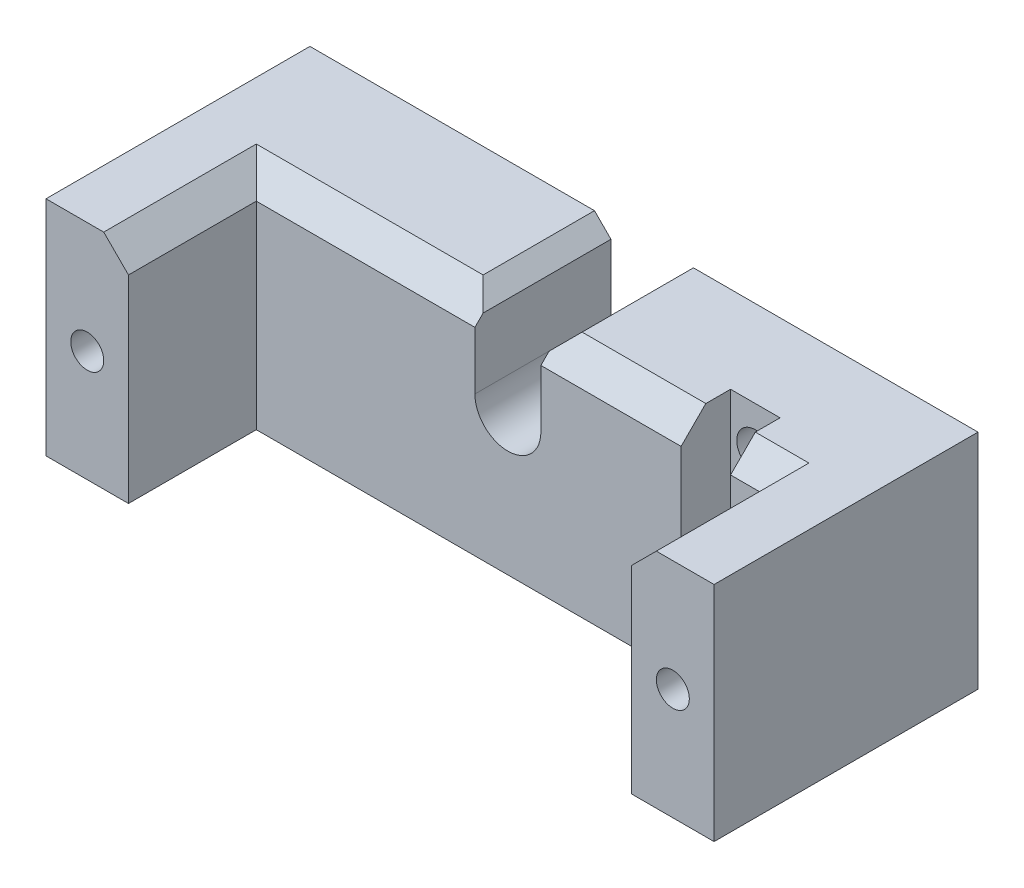
ISO-10303-21;
HEADER;
FILE_DESCRIPTION(('STEP AP214'),'2;1');
FILE_NAME('part.step','',(''),(''),'','','');
FILE_SCHEMA(('AUTOMOTIVE_DESIGN { 1 0 10303 214 1 1 1 1 }'));
ENDSEC;
DATA;
#1=APPLICATION_CONTEXT('core data for automotive mechanical design processes');
#2=APPLICATION_PROTOCOL_DEFINITION('international standard','automotive_design',2000,#1);
#3=PRODUCT_CONTEXT('',#1,'mechanical');
#4=PRODUCT('Part','Part','',(#3));
#5=PRODUCT_RELATED_PRODUCT_CATEGORY('part','',(#4));
#6=PRODUCT_DEFINITION_FORMATION('','',#4);
#7=PRODUCT_DEFINITION_CONTEXT('part definition',#1,'design');
#8=PRODUCT_DEFINITION('design','',#6,#7);
#9=PRODUCT_DEFINITION_SHAPE('','',#8);
#10=(LENGTH_UNIT() NAMED_UNIT(*) SI_UNIT(.MILLI.,.METRE.));
#11=(NAMED_UNIT(*) PLANE_ANGLE_UNIT() SI_UNIT($,.RADIAN.));
#12=(NAMED_UNIT(*) SI_UNIT($,.STERADIAN.) SOLID_ANGLE_UNIT());
#13=UNCERTAINTY_MEASURE_WITH_UNIT(LENGTH_MEASURE(1.E-05),#10,'distance_accuracy_value','');
#14=(GEOMETRIC_REPRESENTATION_CONTEXT(3) GLOBAL_UNCERTAINTY_ASSIGNED_CONTEXT((#13)) GLOBAL_UNIT_ASSIGNED_CONTEXT((#10,
#11,#12)) REPRESENTATION_CONTEXT('',''));
#15=CARTESIAN_POINT('',(0.,0.,0.));
#16=DIRECTION('',(0.,0.,1.));
#17=DIRECTION('',(1.,0.,0.));
#18=AXIS2_PLACEMENT_3D('',#15,#16,#17);
#19=CARTESIAN_POINT('',(0.,0.,16.5));
#20=DIRECTION('',(0.,0.,1.));
#21=DIRECTION('',(1.,0.,0.));
#22=AXIS2_PLACEMENT_3D('',#19,#20,#21);
#23=PLANE('',#22);
#24=DIRECTION('',(0.,1.,0.));
#25=VECTOR('',#24,1.);
#26=CARTESIAN_POINT('',(30.5,13.5,16.5));
#27=LINE('',#26,#25);
#28=CARTESIAN_POINT('',(30.5,-13.5,16.5));
#29=VERTEX_POINT('',#28);
#30=CARTESIAN_POINT('',(30.5,10.5,16.5));
#31=VERTEX_POINT('',#30);
#32=EDGE_CURVE('E346',#29,#31,#27,.T.);
#33=ORIENTED_EDGE('',*,*,#32,.T.);
#34=DIRECTION('',(-1.,0.,0.));
#35=VECTOR('',#34,1.);
#36=CARTESIAN_POINT('',(27.,10.5,16.5));
#37=LINE('',#36,#35);
#38=CARTESIAN_POINT('',(27.,10.5,16.5));
#39=VERTEX_POINT('',#38);
#40=EDGE_CURVE('E419',#31,#39,#37,.T.);
#41=ORIENTED_EDGE('',*,*,#40,.T.);
#42=DIRECTION('',(0.,1.,0.));
#43=VECTOR('',#42,1.);
#44=CARTESIAN_POINT('',(27.,0.,16.5));
#45=LINE('',#44,#43);
#46=CARTESIAN_POINT('',(27.,-13.5,16.5));
#47=VERTEX_POINT('',#46);
#48=EDGE_CURVE('E414',#47,#39,#45,.T.);
#49=ORIENTED_EDGE('',*,*,#48,.F.);
#50=DIRECTION('',(1.,0.,0.));
#51=VECTOR('',#50,1.);
#52=CARTESIAN_POINT('',(-30.5,-13.5,16.5));
#53=LINE('',#52,#51);
#54=EDGE_CURVE('E354',#47,#29,#53,.T.);
#55=ORIENTED_EDGE('',*,*,#54,.T.);
#56=EDGE_LOOP('',(#33,#41,#49,#55));
#57=FACE_BOUND('',#56,.T.);
#58=ADVANCED_FACE('F36',(#57),#23,.T.);
#59=CARTESIAN_POINT('',(-35.5,0.,-8.));
#60=DIRECTION('',(0.,0.,1.));
#61=DIRECTION('',(1.,0.,0.));
#62=AXIS2_PLACEMENT_3D('',#59,#60,#61);
#63=CYLINDRICAL_SURFACE('',#62,2.);
#64=CARTESIAN_POINT('',(-35.5,0.,32.));
#65=DIRECTION('',(0.,0.,1.));
#66=DIRECTION('',(1.,0.,0.));
#67=AXIS2_PLACEMENT_3D('',#64,#65,#66);
#68=CIRCLE('',#67,2.);
#69=CARTESIAN_POINT('',(-33.5,0.,32.));
#70=VERTEX_POINT('',#69);
#71=EDGE_CURVE('E249',#70,#70,#68,.T.);
#72=ORIENTED_EDGE('',*,*,#71,.T.);
#73=EDGE_LOOP('',(#72));
#74=FACE_BOUND('',#73,.T.);
#75=CARTESIAN_POINT('',(-35.5,0.,4.));
#76=DIRECTION('',(0.,0.,-1.));
#77=DIRECTION('',(-1.,0.,0.));
#78=AXIS2_PLACEMENT_3D('',#75,#76,#77);
#79=CIRCLE('',#78,2.);
#80=CARTESIAN_POINT('',(-37.5,0.,4.));
#81=VERTEX_POINT('',#80);
#82=EDGE_CURVE('E258',#81,#81,#79,.F.);
#83=ORIENTED_EDGE('',*,*,#82,.F.);
#84=EDGE_LOOP('',(#83));
#85=FACE_BOUND('',#84,.T.);
#86=ADVANCED_FACE('F605',(#74,#85),#63,.F.);
#87=CARTESIAN_POINT('',(35.5,0.,-8.));
#88=DIRECTION('',(0.,0.,1.));
#89=DIRECTION('',(1.,0.,0.));
#90=AXIS2_PLACEMENT_3D('',#87,#88,#89);
#91=CYLINDRICAL_SURFACE('',#90,2.);
#92=CARTESIAN_POINT('',(35.5,0.,32.));
#93=DIRECTION('',(0.,0.,1.));
#94=DIRECTION('',(1.,0.,0.));
#95=AXIS2_PLACEMENT_3D('',#92,#93,#94);
#96=CIRCLE('',#95,2.);
#97=CARTESIAN_POINT('',(37.5,0.,32.));
#98=VERTEX_POINT('',#97);
#99=EDGE_CURVE('E254',#98,#98,#96,.T.);
#100=ORIENTED_EDGE('',*,*,#99,.T.);
#101=EDGE_LOOP('',(#100));
#102=FACE_BOUND('',#101,.T.);
#103=CARTESIAN_POINT('',(35.5,0.,4.));
#104=DIRECTION('',(0.,0.,-1.));
#105=DIRECTION('',(-1.,0.,0.));
#106=AXIS2_PLACEMENT_3D('',#103,#104,#105);
#107=CIRCLE('',#106,2.);
#108=CARTESIAN_POINT('',(33.5,0.,4.));
#109=VERTEX_POINT('',#108);
#110=EDGE_CURVE('E237',#109,#109,#107,.F.);
#111=ORIENTED_EDGE('',*,*,#110,.F.);
#112=EDGE_LOOP('',(#111));
#113=FACE_BOUND('',#112,.T.);
#114=ADVANCED_FACE('F610',(#102,#113),#91,.F.);
#115=CARTESIAN_POINT('',(-30.5,13.5,16.5));
#116=DIRECTION('',(0.,-1.,0.));
#117=DIRECTION('',(0.,0.,-1.));
#118=AXIS2_PLACEMENT_3D('',#115,#116,#117);
#119=PLANE('',#118);
#120=DIRECTION('',(0.,0.,-1.));
#121=VECTOR('',#120,1.);
#122=CARTESIAN_POINT('',(-33.5,13.5,16.5));
#123=LINE('',#122,#121);
#124=CARTESIAN_POINT('',(-33.5,13.5,32.));
#125=VERTEX_POINT('',#124);
#126=CARTESIAN_POINT('',(-33.5,13.5,13.5));
#127=VERTEX_POINT('',#126);
#128=EDGE_CURVE('E60',#125,#127,#123,.T.);
#129=ORIENTED_EDGE('',*,*,#128,.T.);
#130=DIRECTION('',(1.,0.,0.));
#131=VECTOR('',#130,1.);
#132=CARTESIAN_POINT('',(-6.,13.5,13.5));
#133=LINE('',#132,#131);
#134=CARTESIAN_POINT('',(-5.99999999999999,13.5,13.5));
#135=VERTEX_POINT('',#134);
#136=EDGE_CURVE('E458',#127,#135,#133,.T.);
#137=ORIENTED_EDGE('',*,*,#136,.T.);
#138=DIRECTION('',(0.,0.,-1.));
#139=VECTOR('',#138,1.);
#140=CARTESIAN_POINT('',(-5.99999999999999,13.5,16.5));
#141=LINE('',#140,#139);
#142=CARTESIAN_POINT('',(-6.,13.5,0.));
#143=VERTEX_POINT('',#142);
#144=EDGE_CURVE('E368',#135,#143,#141,.T.);
#145=ORIENTED_EDGE('',*,*,#144,.T.);
#146=DIRECTION('',(-1.,0.,0.));
#147=VECTOR('',#146,1.);
#148=CARTESIAN_POINT('',(-30.5,13.5,0.));
#149=LINE('',#148,#147);
#150=CARTESIAN_POINT('',(-40.5,13.5,0.));
#151=VERTEX_POINT('',#150);
#152=EDGE_CURVE('E343',#143,#151,#149,.T.);
#153=ORIENTED_EDGE('',*,*,#152,.T.);
#154=DIRECTION('',(0.,0.,-1.));
#155=VECTOR('',#154,1.);
#156=CARTESIAN_POINT('',(-40.5,13.5,32.));
#157=LINE('',#156,#155);
#158=CARTESIAN_POINT('',(-40.5,13.5,32.));
#159=VERTEX_POINT('',#158);
#160=EDGE_CURVE('E277',#159,#151,#157,.T.);
#161=ORIENTED_EDGE('',*,*,#160,.F.);
#162=DIRECTION('',(1.,0.,0.));
#163=VECTOR('',#162,1.);
#164=CARTESIAN_POINT('',(-30.5,13.5,32.));
#165=LINE('',#164,#163);
#166=EDGE_CURVE('E270',#159,#125,#165,.T.);
#167=ORIENTED_EDGE('',*,*,#166,.T.);
#168=EDGE_LOOP('',(#129,#137,#145,#153,#161,#167));
#169=FACE_BOUND('',#168,.T.);
#170=ADVANCED_FACE('F555',(#169),#119,.F.);
#171=DIRECTION('',(0.,0.,-1.));
#172=VECTOR('',#171,1.);
#173=CARTESIAN_POINT('',(27.,13.5,16.5));
#174=LINE('',#173,#172);
#175=CARTESIAN_POINT('',(27.,13.5,13.5));
#176=VERTEX_POINT('',#175);
#177=CARTESIAN_POINT('',(27.,13.5,10.5));
#178=VERTEX_POINT('',#177);
#179=EDGE_CURVE('E188',#176,#178,#174,.T.);
#180=ORIENTED_EDGE('',*,*,#179,.F.);
#181=DIRECTION('',(1.,0.,0.));
#182=VECTOR('',#181,1.);
#183=CARTESIAN_POINT('',(33.5,13.5,13.5));
#184=LINE('',#183,#182);
#185=CARTESIAN_POINT('',(33.5,13.5,13.5));
#186=VERTEX_POINT('',#185);
#187=EDGE_CURVE('E438',#176,#186,#184,.T.);
#188=ORIENTED_EDGE('',*,*,#187,.T.);
#189=DIRECTION('',(0.,0.,1.));
#190=VECTOR('',#189,1.);
#191=CARTESIAN_POINT('',(33.5,13.5,32.));
#192=LINE('',#191,#190);
#193=CARTESIAN_POINT('',(33.5,13.5,32.));
#194=VERTEX_POINT('',#193);
#195=EDGE_CURVE('E405',#186,#194,#192,.T.);
#196=ORIENTED_EDGE('',*,*,#195,.T.);
#197=DIRECTION('',(1.,0.,0.));
#198=VECTOR('',#197,1.);
#199=CARTESIAN_POINT('',(30.5,13.5,32.));
#200=LINE('',#199,#198);
#201=CARTESIAN_POINT('',(40.5,13.5,32.));
#202=VERTEX_POINT('',#201);
#203=EDGE_CURVE('E293',#194,#202,#200,.T.);
#204=ORIENTED_EDGE('',*,*,#203,.T.);
#205=DIRECTION('',(0.,0.,-1.));
#206=VECTOR('',#205,1.);
#207=CARTESIAN_POINT('',(40.5,13.5,32.));
#208=LINE('',#207,#206);
#209=CARTESIAN_POINT('',(40.5,13.5,0.));
#210=VERTEX_POINT('',#209);
#211=EDGE_CURVE('E304',#202,#210,#208,.T.);
#212=ORIENTED_EDGE('',*,*,#211,.T.);
#213=CARTESIAN_POINT('',(5.99999999999997,13.5,0.));
#214=VERTEX_POINT('',#213);
#215=EDGE_CURVE('E360',#210,#214,#149,.T.);
#216=ORIENTED_EDGE('',*,*,#215,.T.);
#217=DIRECTION('',(0.,0.,1.));
#218=VECTOR('',#217,1.);
#219=CARTESIAN_POINT('',(5.99999999999998,13.5,16.5));
#220=LINE('',#219,#218);
#221=CARTESIAN_POINT('',(5.99999999999998,13.5,13.5));
#222=VERTEX_POINT('',#221);
#223=EDGE_CURVE('E386',#214,#222,#220,.T.);
#224=ORIENTED_EDGE('',*,*,#223,.T.);
#225=DIRECTION('',(1.,0.,0.));
#226=VECTOR('',#225,1.);
#227=CARTESIAN_POINT('',(21.,13.5,13.5));
#228=LINE('',#227,#226);
#229=CARTESIAN_POINT('',(21.,13.5,13.5));
#230=VERTEX_POINT('',#229);
#231=EDGE_CURVE('E435',#222,#230,#228,.T.);
#232=ORIENTED_EDGE('',*,*,#231,.T.);
#233=DIRECTION('',(0.,0.,1.));
#234=VECTOR('',#233,1.);
#235=CARTESIAN_POINT('',(21.,13.5,16.5));
#236=LINE('',#235,#234);
#237=CARTESIAN_POINT('',(21.,13.5,10.5));
#238=VERTEX_POINT('',#237);
#239=EDGE_CURVE('E212',#238,#230,#236,.T.);
#240=ORIENTED_EDGE('',*,*,#239,.F.);
#241=DIRECTION('',(-1.,0.,0.));
#242=VECTOR('',#241,1.);
#243=CARTESIAN_POINT('',(27.,13.5,10.5));
#244=LINE('',#243,#242);
#245=EDGE_CURVE('E200',#178,#238,#244,.T.);
#246=ORIENTED_EDGE('',*,*,#245,.F.);
#247=EDGE_LOOP('',(#180,#188,#196,#204,#212,#216,#224,#232,#240,#246));
#248=FACE_BOUND('',#247,.T.);
#249=ADVANCED_FACE('F214',(#248),#119,.F.);
#250=CARTESIAN_POINT('',(-30.5,-13.5,16.5));
#251=DIRECTION('',(0.,1.,0.));
#252=DIRECTION('',(0.,0.,1.));
#253=AXIS2_PLACEMENT_3D('',#250,#251,#252);
#254=PLANE('',#253);
#255=ORIENTED_EDGE('',*,*,#54,.F.);
#256=DIRECTION('',(0.,0.,-1.));
#257=VECTOR('',#256,1.);
#258=CARTESIAN_POINT('',(27.,-13.5,16.5));
#259=LINE('',#258,#257);
#260=CARTESIAN_POINT('',(27.,-13.5,10.5));
#261=VERTEX_POINT('',#260);
#262=EDGE_CURVE('E229',#47,#261,#259,.T.);
#263=ORIENTED_EDGE('',*,*,#262,.T.);
#264=DIRECTION('',(-1.,0.,0.));
#265=VECTOR('',#264,1.);
#266=CARTESIAN_POINT('',(-30.5,-13.5,10.5));
#267=LINE('',#266,#265);
#268=CARTESIAN_POINT('',(21.,-13.5,10.5));
#269=VERTEX_POINT('',#268);
#270=EDGE_CURVE('E209',#261,#269,#267,.T.);
#271=ORIENTED_EDGE('',*,*,#270,.T.);
#272=DIRECTION('',(0.,0.,1.));
#273=VECTOR('',#272,1.);
#274=CARTESIAN_POINT('',(21.,-13.5,16.5));
#275=LINE('',#274,#273);
#276=CARTESIAN_POINT('',(21.,-13.5,16.5));
#277=VERTEX_POINT('',#276);
#278=EDGE_CURVE('E224',#269,#277,#275,.T.);
#279=ORIENTED_EDGE('',*,*,#278,.T.);
#280=CARTESIAN_POINT('',(-30.5,-13.5,16.5));
#281=VERTEX_POINT('',#280);
#282=EDGE_CURVE('E355',#281,#277,#53,.T.);
#283=ORIENTED_EDGE('',*,*,#282,.F.);
#284=DIRECTION('',(0.,0.,-1.));
#285=VECTOR('',#284,1.);
#286=CARTESIAN_POINT('',(-30.5,-13.5,32.));
#287=LINE('',#286,#285);
#288=CARTESIAN_POINT('',(-30.5,-13.5,32.));
#289=VERTEX_POINT('',#288);
#290=EDGE_CURVE('E273',#289,#281,#287,.T.);
#291=ORIENTED_EDGE('',*,*,#290,.F.);
#292=DIRECTION('',(-1.,0.,0.));
#293=VECTOR('',#292,1.);
#294=CARTESIAN_POINT('',(-30.5,-13.5,32.));
#295=LINE('',#294,#293);
#296=CARTESIAN_POINT('',(-40.5,-13.5,32.));
#297=VERTEX_POINT('',#296);
#298=EDGE_CURVE('E262',#289,#297,#295,.T.);
#299=ORIENTED_EDGE('',*,*,#298,.T.);
#300=DIRECTION('',(0.,0.,-1.));
#301=VECTOR('',#300,1.);
#302=CARTESIAN_POINT('',(-40.5,-13.5,32.));
#303=LINE('',#302,#301);
#304=CARTESIAN_POINT('',(-40.5,-13.5,0.));
#305=VERTEX_POINT('',#304);
#306=EDGE_CURVE('E282',#297,#305,#303,.T.);
#307=ORIENTED_EDGE('',*,*,#306,.T.);
#308=DIRECTION('',(1.,0.,0.));
#309=VECTOR('',#308,1.);
#310=CARTESIAN_POINT('',(-30.5,-13.5,0.));
#311=LINE('',#310,#309);
#312=CARTESIAN_POINT('',(40.5,-13.5,0.));
#313=VERTEX_POINT('',#312);
#314=EDGE_CURVE('E351',#305,#313,#311,.T.);
#315=ORIENTED_EDGE('',*,*,#314,.T.);
#316=DIRECTION('',(0.,0.,-1.));
#317=VECTOR('',#316,1.);
#318=CARTESIAN_POINT('',(40.5,-13.5,32.));
#319=LINE('',#318,#317);
#320=CARTESIAN_POINT('',(40.5,-13.5,32.));
#321=VERTEX_POINT('',#320);
#322=EDGE_CURVE('E313',#321,#313,#319,.T.);
#323=ORIENTED_EDGE('',*,*,#322,.F.);
#324=DIRECTION('',(-1.,0.,0.));
#325=VECTOR('',#324,1.);
#326=CARTESIAN_POINT('',(30.5,-13.5,32.));
#327=LINE('',#326,#325);
#328=CARTESIAN_POINT('',(30.5,-13.5,32.));
#329=VERTEX_POINT('',#328);
#330=EDGE_CURVE('E300',#321,#329,#327,.T.);
#331=ORIENTED_EDGE('',*,*,#330,.T.);
#332=DIRECTION('',(0.,0.,-1.));
#333=VECTOR('',#332,1.);
#334=CARTESIAN_POINT('',(30.5,-13.5,32.));
#335=LINE('',#334,#333);
#336=EDGE_CURVE('E308',#329,#29,#335,.T.);
#337=ORIENTED_EDGE('',*,*,#336,.T.);
#338=EDGE_LOOP('',(#255,#263,#271,#279,#283,#291,#299,#307,#315,#323,#331,#337));
#339=FACE_BOUND('',#338,.T.);
#340=ADVANCED_FACE('F507',(#339),#254,.F.);
#341=DIRECTION('',(0.,-1.,0.));
#342=VECTOR('',#341,1.);
#343=CARTESIAN_POINT('',(21.,0.,16.5));
#344=LINE('',#343,#342);
#345=CARTESIAN_POINT('',(21.,10.5,16.5));
#346=VERTEX_POINT('',#345);
#347=EDGE_CURVE('E411',#346,#277,#344,.T.);
#348=ORIENTED_EDGE('',*,*,#347,.F.);
#349=DIRECTION('',(-1.,0.,0.));
#350=VECTOR('',#349,1.);
#351=CARTESIAN_POINT('',(5.99999999999997,10.5,16.5));
#352=LINE('',#351,#350);
#353=CARTESIAN_POINT('',(4.,10.5,16.5));
#354=VERTEX_POINT('',#353);
#355=EDGE_CURVE('E445',#346,#354,#352,.T.);
#356=ORIENTED_EDGE('',*,*,#355,.T.);
#357=DIRECTION('',(0.,1.,0.));
#358=VECTOR('',#357,1.);
#359=CARTESIAN_POINT('',(3.99999999999999,38.5243902439026,16.5));
#360=LINE('',#359,#358);
#361=CARTESIAN_POINT('',(4.,3.5,16.5));
#362=VERTEX_POINT('',#361);
#363=EDGE_CURVE('E333',#362,#354,#360,.T.);
#364=ORIENTED_EDGE('',*,*,#363,.F.);
#365=CARTESIAN_POINT('',(0.,3.5,16.5));
#366=DIRECTION('',(0.,0.,1.));
#367=DIRECTION('',(1.,0.,0.));
#368=AXIS2_PLACEMENT_3D('',#365,#366,#367);
#369=CIRCLE('',#368,4.);
#370=CARTESIAN_POINT('',(-4.,3.5,16.5));
#371=VERTEX_POINT('',#370);
#372=EDGE_CURVE('E312',#371,#362,#369,.T.);
#373=ORIENTED_EDGE('',*,*,#372,.F.);
#374=DIRECTION('',(0.,-1.,0.));
#375=VECTOR('',#374,1.);
#376=CARTESIAN_POINT('',(-4.00000000000001,38.5243902439026,16.5));
#377=LINE('',#376,#375);
#378=CARTESIAN_POINT('',(-4.,10.5,16.5));
#379=VERTEX_POINT('',#378);
#380=EDGE_CURVE('E325',#379,#371,#377,.T.);
#381=ORIENTED_EDGE('',*,*,#380,.F.);
#382=DIRECTION('',(-1.,0.,0.));
#383=VECTOR('',#382,1.);
#384=CARTESIAN_POINT('',(-33.5,10.5,16.5));
#385=LINE('',#384,#383);
#386=CARTESIAN_POINT('',(-30.5,10.5,16.5));
#387=VERTEX_POINT('',#386);
#388=EDGE_CURVE('E441',#379,#387,#385,.T.);
#389=ORIENTED_EDGE('',*,*,#388,.T.);
#390=DIRECTION('',(0.,-1.,0.));
#391=VECTOR('',#390,1.);
#392=CARTESIAN_POINT('',(-30.5,13.5,16.5));
#393=LINE('',#392,#391);
#394=EDGE_CURVE('E350',#387,#281,#393,.T.);
#395=ORIENTED_EDGE('',*,*,#394,.T.);
#396=ORIENTED_EDGE('',*,*,#282,.T.);
#397=EDGE_LOOP('',(#348,#356,#364,#373,#381,#389,#395,#396));
#398=FACE_BOUND('',#397,.T.);
#399=ADVANCED_FACE('F591',(#398),#23,.T.);
#400=CARTESIAN_POINT('',(0.,0.,0.));
#401=DIRECTION('',(0.,0.,1.));
#402=DIRECTION('',(1.,0.,0.));
#403=AXIS2_PLACEMENT_3D('',#400,#401,#402);
#404=PLANE('',#403);
#405=CARTESIAN_POINT('',(24.,8.5,0.));
#406=DIRECTION('',(0.,0.,1.));
#407=DIRECTION('',(1.,0.,0.));
#408=AXIS2_PLACEMENT_3D('',#405,#406,#407);
#409=CIRCLE('',#408,1.5);
#410=CARTESIAN_POINT('',(25.5,8.5,0.));
#411=VERTEX_POINT('',#410);
#412=EDGE_CURVE('E424',#411,#411,#409,.T.);
#413=ORIENTED_EDGE('',*,*,#412,.T.);
#414=EDGE_LOOP('',(#413));
#415=FACE_BOUND('',#414,.T.);
#416=CARTESIAN_POINT('',(24.,-8.5,0.));
#417=DIRECTION('',(0.,0.,1.));
#418=DIRECTION('',(1.,0.,0.));
#419=AXIS2_PLACEMENT_3D('',#416,#417,#418);
#420=CIRCLE('',#419,1.5);
#421=CARTESIAN_POINT('',(25.5,-8.5,0.));
#422=VERTEX_POINT('',#421);
#423=EDGE_CURVE('E420',#422,#422,#420,.T.);
#424=ORIENTED_EDGE('',*,*,#423,.T.);
#425=EDGE_LOOP('',(#424));
#426=FACE_BOUND('',#425,.T.);
#427=CARTESIAN_POINT('',(35.5,0.,0.));
#428=DIRECTION('',(0.,0.,-1.));
#429=DIRECTION('',(-1.,0.,0.));
#430=AXIS2_PLACEMENT_3D('',#427,#428,#429);
#431=CIRCLE('',#430,3.75);
#432=CARTESIAN_POINT('',(31.75,0.,0.));
#433=VERTEX_POINT('',#432);
#434=EDGE_CURVE('E238',#433,#433,#431,.T.);
#435=ORIENTED_EDGE('',*,*,#434,.F.);
#436=EDGE_LOOP('',(#435));
#437=FACE_BOUND('',#436,.T.);
#438=CARTESIAN_POINT('',(-35.5,0.,0.));
#439=DIRECTION('',(0.,0.,-1.));
#440=DIRECTION('',(-1.,0.,0.));
#441=AXIS2_PLACEMENT_3D('',#438,#439,#440);
#442=CIRCLE('',#441,3.75000000000001);
#443=CARTESIAN_POINT('',(-39.25,0.,0.));
#444=VERTEX_POINT('',#443);
#445=EDGE_CURVE('E232',#444,#444,#442,.T.);
#446=ORIENTED_EDGE('',*,*,#445,.F.);
#447=EDGE_LOOP('',(#446));
#448=FACE_BOUND('',#447,.T.);
#449=ORIENTED_EDGE('',*,*,#152,.F.);
#450=DIRECTION('',(-0.707106781186545,0.70710678118655,0.));
#451=VECTOR('',#450,1.);
#452=CARTESIAN_POINT('',(-5.99999999999999,13.5,0.));
#453=LINE('',#452,#451);
#454=CARTESIAN_POINT('',(-4.00000000000001,11.5,0.));
#455=VERTEX_POINT('',#454);
#456=EDGE_CURVE('E380',#143,#455,#453,.F.);
#457=ORIENTED_EDGE('',*,*,#456,.T.);
#458=DIRECTION('',(0.,-1.,0.));
#459=VECTOR('',#458,1.);
#460=CARTESIAN_POINT('',(-4.,0.,0.));
#461=LINE('',#460,#459);
#462=CARTESIAN_POINT('',(-4.,3.5,0.));
#463=VERTEX_POINT('',#462);
#464=EDGE_CURVE('E359',#455,#463,#461,.T.);
#465=ORIENTED_EDGE('',*,*,#464,.T.);
#466=CARTESIAN_POINT('',(0.,3.5,0.));
#467=DIRECTION('',(0.,0.,1.));
#468=DIRECTION('',(1.,0.,0.));
#469=AXIS2_PLACEMENT_3D('',#466,#467,#468);
#470=CIRCLE('',#469,4.);
#471=CARTESIAN_POINT('',(4.,3.5,0.));
#472=VERTEX_POINT('',#471);
#473=EDGE_CURVE('E320',#463,#472,#470,.T.);
#474=ORIENTED_EDGE('',*,*,#473,.T.);
#475=DIRECTION('',(0.,1.,0.));
#476=VECTOR('',#475,1.);
#477=CARTESIAN_POINT('',(3.99999999999999,38.5243902439026,0.));
#478=LINE('',#477,#476);
#479=CARTESIAN_POINT('',(4.,11.5,0.));
#480=VERTEX_POINT('',#479);
#481=EDGE_CURVE('E324',#472,#480,#478,.T.);
#482=ORIENTED_EDGE('',*,*,#481,.T.);
#483=DIRECTION('',(-0.707106781186544,-0.707106781186551,0.));
#484=VECTOR('',#483,1.);
#485=CARTESIAN_POINT('',(5.99999999999998,13.5,0.));
#486=LINE('',#485,#484);
#487=EDGE_CURVE('E377',#480,#214,#486,.F.);
#488=ORIENTED_EDGE('',*,*,#487,.T.);
#489=ORIENTED_EDGE('',*,*,#215,.F.);
#490=DIRECTION('',(0.,-1.,0.));
#491=VECTOR('',#490,1.);
#492=CARTESIAN_POINT('',(40.5,-13.5,0.));
#493=LINE('',#492,#491);
#494=EDGE_CURVE('E281',#210,#313,#493,.T.);
#495=ORIENTED_EDGE('',*,*,#494,.T.);
#496=ORIENTED_EDGE('',*,*,#314,.F.);
#497=DIRECTION('',(0.,1.,0.));
#498=VECTOR('',#497,1.);
#499=CARTESIAN_POINT('',(-40.5,13.5,0.));
#500=LINE('',#499,#498);
#501=EDGE_CURVE('E253',#305,#151,#500,.T.);
#502=ORIENTED_EDGE('',*,*,#501,.T.);
#503=EDGE_LOOP('',(#449,#457,#465,#474,#482,#488,#489,#495,#496,#502));
#504=FACE_BOUND('',#503,.T.);
#505=ADVANCED_FACE('F562',(#415,#426,#437,#448,#504),#404,.F.);
#506=CARTESIAN_POINT('',(-4.00000000000001,38.5243902439026,0.));
#507=DIRECTION('',(-1.,0.,0.));
#508=DIRECTION('',(0.,-1.,0.));
#509=AXIS2_PLACEMENT_3D('',#506,#507,#508);
#510=PLANE('',#509);
#511=DIRECTION('',(0.,0.,1.));
#512=VECTOR('',#511,1.);
#513=CARTESIAN_POINT('',(-4.,11.5,0.));
#514=LINE('',#513,#512);
#515=CARTESIAN_POINT('',(-4.,11.5,15.5));
#516=VERTEX_POINT('',#515);
#517=EDGE_CURVE('E383',#455,#516,#514,.T.);
#518=ORIENTED_EDGE('',*,*,#517,.T.);
#519=DIRECTION('',(0.,-0.707106781186546,0.707106781186549));
#520=VECTOR('',#519,1.);
#521=CARTESIAN_POINT('',(-4.,10.5,16.5));
#522=LINE('',#521,#520);
#523=EDGE_CURVE('E463',#516,#379,#522,.T.);
#524=ORIENTED_EDGE('',*,*,#523,.T.);
#525=ORIENTED_EDGE('',*,*,#380,.T.);
#526=DIRECTION('',(0.,0.,1.));
#527=VECTOR('',#526,1.);
#528=CARTESIAN_POINT('',(-4.,3.5,0.));
#529=LINE('',#528,#527);
#530=EDGE_CURVE('E339',#463,#371,#529,.T.);
#531=ORIENTED_EDGE('',*,*,#530,.F.);
#532=ORIENTED_EDGE('',*,*,#464,.F.);
#533=EDGE_LOOP('',(#518,#524,#525,#531,#532));
#534=FACE_BOUND('',#533,.T.);
#535=ADVANCED_FACE('F580',(#534),#510,.F.);
#536=CARTESIAN_POINT('',(3.99999999999999,38.5243902439026,0.));
#537=DIRECTION('',(1.,0.,0.));
#538=DIRECTION('',(0.,1.,0.));
#539=AXIS2_PLACEMENT_3D('',#536,#537,#538);
#540=PLANE('',#539);
#541=ORIENTED_EDGE('',*,*,#363,.T.);
#542=DIRECTION('',(0.,0.707106781186546,-0.707106781186549));
#543=VECTOR('',#542,1.);
#544=CARTESIAN_POINT('',(4.,10.5,16.5));
#545=LINE('',#544,#543);
#546=CARTESIAN_POINT('',(4.,11.5,15.5));
#547=VERTEX_POINT('',#546);
#548=EDGE_CURVE('E449',#354,#547,#545,.T.);
#549=ORIENTED_EDGE('',*,*,#548,.T.);
#550=DIRECTION('',(0.,0.,-1.));
#551=VECTOR('',#550,1.);
#552=CARTESIAN_POINT('',(4.,11.5,0.));
#553=LINE('',#552,#551);
#554=EDGE_CURVE('E390',#547,#480,#553,.T.);
#555=ORIENTED_EDGE('',*,*,#554,.T.);
#556=ORIENTED_EDGE('',*,*,#481,.F.);
#557=DIRECTION('',(0.,0.,1.));
#558=VECTOR('',#557,1.);
#559=CARTESIAN_POINT('',(4.,3.5,0.));
#560=LINE('',#559,#558);
#561=EDGE_CURVE('E329',#472,#362,#560,.T.);
#562=ORIENTED_EDGE('',*,*,#561,.T.);
#563=EDGE_LOOP('',(#541,#549,#555,#556,#562));
#564=FACE_BOUND('',#563,.T.);
#565=ADVANCED_FACE('F588',(#564),#540,.F.);
#566=CARTESIAN_POINT('',(0.,3.5,0.));
#567=DIRECTION('',(0.,0.,1.));
#568=DIRECTION('',(1.,0.,0.));
#569=AXIS2_PLACEMENT_3D('',#566,#567,#568);
#570=CYLINDRICAL_SURFACE('',#569,4.);
#571=ORIENTED_EDGE('',*,*,#372,.T.);
#572=ORIENTED_EDGE('',*,*,#561,.F.);
#573=ORIENTED_EDGE('',*,*,#473,.F.);
#574=ORIENTED_EDGE('',*,*,#530,.T.);
#575=EDGE_LOOP('',(#571,#572,#573,#574));
#576=FACE_BOUND('',#575,.T.);
#577=ADVANCED_FACE('F585',(#576),#570,.F.);
#578=CARTESIAN_POINT('',(30.5,-13.5,32.));
#579=DIRECTION('',(-1.,0.,0.));
#580=DIRECTION('',(0.,0.,1.));
#581=AXIS2_PLACEMENT_3D('',#578,#579,#580);
#582=PLANE('',#581);
#583=DIRECTION('',(0.,1.,0.));
#584=VECTOR('',#583,1.);
#585=CARTESIAN_POINT('',(30.5,-13.5,32.));
#586=LINE('',#585,#584);
#587=CARTESIAN_POINT('',(30.5,10.5,32.));
#588=VERTEX_POINT('',#587);
#589=EDGE_CURVE('E289',#329,#588,#586,.T.);
#590=ORIENTED_EDGE('',*,*,#589,.T.);
#591=DIRECTION('',(0.,0.,-1.));
#592=VECTOR('',#591,1.);
#593=CARTESIAN_POINT('',(30.5,10.5,16.5));
#594=LINE('',#593,#592);
#595=EDGE_CURVE('E401',#588,#31,#594,.T.);
#596=ORIENTED_EDGE('',*,*,#595,.T.);
#597=ORIENTED_EDGE('',*,*,#32,.F.);
#598=ORIENTED_EDGE('',*,*,#336,.F.);
#599=EDGE_LOOP('',(#590,#596,#597,#598));
#600=FACE_BOUND('',#599,.T.);
#601=ADVANCED_FACE('F476',(#600),#582,.T.);
#602=CARTESIAN_POINT('',(40.5,-13.5,32.));
#603=DIRECTION('',(1.,0.,0.));
#604=DIRECTION('',(0.,0.,-1.));
#605=AXIS2_PLACEMENT_3D('',#602,#603,#604);
#606=PLANE('',#605);
#607=ORIENTED_EDGE('',*,*,#494,.F.);
#608=ORIENTED_EDGE('',*,*,#211,.F.);
#609=DIRECTION('',(0.,-1.,0.));
#610=VECTOR('',#609,1.);
#611=CARTESIAN_POINT('',(40.5,-13.5,32.));
#612=LINE('',#611,#610);
#613=EDGE_CURVE('E296',#202,#321,#612,.T.);
#614=ORIENTED_EDGE('',*,*,#613,.T.);
#615=ORIENTED_EDGE('',*,*,#322,.T.);
#616=EDGE_LOOP('',(#607,#608,#614,#615));
#617=FACE_BOUND('',#616,.T.);
#618=ADVANCED_FACE('F490',(#617),#606,.T.);
#619=CARTESIAN_POINT('',(0.,0.,32.));
#620=DIRECTION('',(0.,0.,-1.));
#621=DIRECTION('',(-1.,0.,0.));
#622=AXIS2_PLACEMENT_3D('',#619,#620,#621);
#623=PLANE('',#622);
#624=ORIENTED_EDGE('',*,*,#99,.F.);
#625=EDGE_LOOP('',(#624));
#626=FACE_BOUND('',#625,.T.);
#627=ORIENTED_EDGE('',*,*,#203,.F.);
#628=DIRECTION('',(-0.70710678118655,-0.707106781186545,0.));
#629=VECTOR('',#628,1.);
#630=CARTESIAN_POINT('',(30.5,10.5,32.));
#631=LINE('',#630,#629);
#632=EDGE_CURVE('E408',#194,#588,#631,.T.);
#633=ORIENTED_EDGE('',*,*,#632,.T.);
#634=ORIENTED_EDGE('',*,*,#589,.F.);
#635=ORIENTED_EDGE('',*,*,#330,.F.);
#636=ORIENTED_EDGE('',*,*,#613,.F.);
#637=EDGE_LOOP('',(#627,#633,#634,#635,#636));
#638=FACE_BOUND('',#637,.T.);
#639=ADVANCED_FACE('F486',(#626,#638),#623,.F.);
#640=CARTESIAN_POINT('',(-30.5,13.5,32.));
#641=DIRECTION('',(1.,0.,0.));
#642=DIRECTION('',(0.,1.,0.));
#643=AXIS2_PLACEMENT_3D('',#640,#641,#642);
#644=PLANE('',#643);
#645=ORIENTED_EDGE('',*,*,#394,.F.);
#646=DIRECTION('',(0.,0.,1.));
#647=VECTOR('',#646,1.);
#648=CARTESIAN_POINT('',(-30.5,10.5,32.));
#649=LINE('',#648,#647);
#650=CARTESIAN_POINT('',(-30.5,10.5,32.));
#651=VERTEX_POINT('',#650);
#652=EDGE_CURVE('E395',#387,#651,#649,.T.);
#653=ORIENTED_EDGE('',*,*,#652,.T.);
#654=DIRECTION('',(0.,-1.,0.));
#655=VECTOR('',#654,1.);
#656=CARTESIAN_POINT('',(-30.5,13.5,32.));
#657=LINE('',#656,#655);
#658=EDGE_CURVE('E259',#651,#289,#657,.T.);
#659=ORIENTED_EDGE('',*,*,#658,.T.);
#660=ORIENTED_EDGE('',*,*,#290,.T.);
#661=EDGE_LOOP('',(#645,#653,#659,#660));
#662=FACE_BOUND('',#661,.T.);
#663=ADVANCED_FACE('F594',(#662),#644,.T.);
#664=CARTESIAN_POINT('',(-40.5,13.5,32.));
#665=DIRECTION('',(-1.,0.,0.));
#666=DIRECTION('',(0.,0.,1.));
#667=AXIS2_PLACEMENT_3D('',#664,#665,#666);
#668=PLANE('',#667);
#669=ORIENTED_EDGE('',*,*,#501,.F.);
#670=ORIENTED_EDGE('',*,*,#306,.F.);
#671=DIRECTION('',(0.,1.,0.));
#672=VECTOR('',#671,1.);
#673=CARTESIAN_POINT('',(-40.5,13.5,32.));
#674=LINE('',#673,#672);
#675=EDGE_CURVE('E266',#297,#159,#674,.T.);
#676=ORIENTED_EDGE('',*,*,#675,.T.);
#677=ORIENTED_EDGE('',*,*,#160,.T.);
#678=EDGE_LOOP('',(#669,#670,#676,#677));
#679=FACE_BOUND('',#678,.T.);
#680=ADVANCED_FACE('F559',(#679),#668,.T.);
#681=CARTESIAN_POINT('',(0.,0.,32.));
#682=DIRECTION('',(0.,0.,-1.));
#683=DIRECTION('',(-1.,0.,0.));
#684=AXIS2_PLACEMENT_3D('',#681,#682,#683);
#685=PLANE('',#684);
#686=ORIENTED_EDGE('',*,*,#71,.F.);
#687=EDGE_LOOP('',(#686));
#688=FACE_BOUND('',#687,.T.);
#689=ORIENTED_EDGE('',*,*,#658,.F.);
#690=DIRECTION('',(-0.707106781186545,0.70710678118655,0.));
#691=VECTOR('',#690,1.);
#692=CARTESIAN_POINT('',(-33.5,13.5,32.));
#693=LINE('',#692,#691);
#694=EDGE_CURVE('E398',#651,#125,#693,.T.);
#695=ORIENTED_EDGE('',*,*,#694,.T.);
#696=ORIENTED_EDGE('',*,*,#166,.F.);
#697=ORIENTED_EDGE('',*,*,#675,.F.);
#698=ORIENTED_EDGE('',*,*,#298,.F.);
#699=EDGE_LOOP('',(#689,#695,#696,#697,#698));
#700=FACE_BOUND('',#699,.T.);
#701=ADVANCED_FACE('F567',(#688,#700),#685,.F.);
#702=CARTESIAN_POINT('',(35.5,0.,4.));
#703=DIRECTION('',(0.,0.,-1.));
#704=DIRECTION('',(-1.,0.,0.));
#705=AXIS2_PLACEMENT_3D('',#702,#703,#704);
#706=PLANE('',#705);
#707=CARTESIAN_POINT('',(35.5,0.,4.));
#708=DIRECTION('',(0.,0.,-1.));
#709=DIRECTION('',(-1.,0.,0.));
#710=AXIS2_PLACEMENT_3D('',#707,#708,#709);
#711=CIRCLE('',#710,3.75);
#712=CARTESIAN_POINT('',(31.75,0.,4.));
#713=VERTEX_POINT('',#712);
#714=EDGE_CURVE('E233',#713,#713,#711,.T.);
#715=ORIENTED_EDGE('',*,*,#714,.T.);
#716=EDGE_LOOP('',(#715));
#717=FACE_BOUND('',#716,.T.);
#718=ORIENTED_EDGE('',*,*,#110,.T.);
#719=EDGE_LOOP('',(#718));
#720=FACE_BOUND('',#719,.T.);
#721=ADVANCED_FACE('F796',(#717,#720),#706,.T.);
#722=CARTESIAN_POINT('',(35.5,0.,4.));
#723=DIRECTION('',(0.,0.,-1.));
#724=DIRECTION('',(-1.,0.,0.));
#725=AXIS2_PLACEMENT_3D('',#722,#723,#724);
#726=CYLINDRICAL_SURFACE('',#725,3.75);
#727=ORIENTED_EDGE('',*,*,#714,.F.);
#728=EDGE_LOOP('',(#727));
#729=FACE_BOUND('',#728,.T.);
#730=ORIENTED_EDGE('',*,*,#434,.T.);
#731=EDGE_LOOP('',(#730));
#732=FACE_BOUND('',#731,.T.);
#733=ADVANCED_FACE('F786',(#729,#732),#726,.F.);
#734=CARTESIAN_POINT('',(-35.5,0.,4.));
#735=DIRECTION('',(0.,0.,-1.));
#736=DIRECTION('',(-1.,0.,0.));
#737=AXIS2_PLACEMENT_3D('',#734,#735,#736);
#738=PLANE('',#737);
#739=CARTESIAN_POINT('',(-35.5,0.,4.));
#740=DIRECTION('',(0.,0.,-1.));
#741=DIRECTION('',(-1.,0.,0.));
#742=AXIS2_PLACEMENT_3D('',#739,#740,#741);
#743=CIRCLE('',#742,3.75000000000001);
#744=CARTESIAN_POINT('',(-39.25,0.,4.));
#745=VERTEX_POINT('',#744);
#746=EDGE_CURVE('E242',#745,#745,#743,.T.);
#747=ORIENTED_EDGE('',*,*,#746,.T.);
#748=EDGE_LOOP('',(#747));
#749=FACE_BOUND('',#748,.T.);
#750=ORIENTED_EDGE('',*,*,#82,.T.);
#751=EDGE_LOOP('',(#750));
#752=FACE_BOUND('',#751,.T.);
#753=ADVANCED_FACE('F775',(#749,#752),#738,.T.);
#754=CARTESIAN_POINT('',(-35.5,0.,4.));
#755=DIRECTION('',(0.,0.,-1.));
#756=DIRECTION('',(-1.,0.,0.));
#757=AXIS2_PLACEMENT_3D('',#754,#755,#756);
#758=CYLINDRICAL_SURFACE('',#757,3.75000000000001);
#759=ORIENTED_EDGE('',*,*,#746,.F.);
#760=EDGE_LOOP('',(#759));
#761=FACE_BOUND('',#760,.T.);
#762=ORIENTED_EDGE('',*,*,#445,.T.);
#763=EDGE_LOOP('',(#762));
#764=FACE_BOUND('',#763,.T.);
#765=ADVANCED_FACE('F629',(#761,#764),#758,.F.);
#766=CARTESIAN_POINT('',(-5.99999999999999,13.5,16.5));
#767=DIRECTION('',(-0.70710678118655,-0.707106781186545,0.));
#768=DIRECTION('',(0.,0.,-1.));
#769=AXIS2_PLACEMENT_3D('',#766,#767,#768);
#770=PLANE('',#769);
#771=ORIENTED_EDGE('',*,*,#144,.F.);
#772=DIRECTION('',(-0.577350269189622,0.577350269189627,-0.577350269189629));
#773=VECTOR('',#772,1.);
#774=CARTESIAN_POINT('',(-4.99999999999999,12.5,14.5));
#775=LINE('',#774,#773);
#776=EDGE_CURVE('E52',#135,#516,#775,.F.);
#777=ORIENTED_EDGE('',*,*,#776,.T.);
#778=ORIENTED_EDGE('',*,*,#517,.F.);
#779=ORIENTED_EDGE('',*,*,#456,.F.);
#780=EDGE_LOOP('',(#771,#777,#778,#779));
#781=FACE_BOUND('',#780,.T.);
#782=ADVANCED_FACE('F576',(#781),#770,.F.);
#783=CARTESIAN_POINT('',(5.99999999999998,13.5,16.5));
#784=DIRECTION('',(0.707106781186551,-0.707106781186544,0.));
#785=DIRECTION('',(0.,0.,1.));
#786=AXIS2_PLACEMENT_3D('',#783,#784,#785);
#787=PLANE('',#786);
#788=ORIENTED_EDGE('',*,*,#554,.F.);
#789=DIRECTION('',(-0.577350269189621,-0.577350269189627,0.577350269189629));
#790=VECTOR('',#789,1.);
#791=CARTESIAN_POINT('',(4.99999999999998,12.5,14.5));
#792=LINE('',#791,#790);
#793=EDGE_CURVE('E452',#547,#222,#792,.F.);
#794=ORIENTED_EDGE('',*,*,#793,.T.);
#795=ORIENTED_EDGE('',*,*,#223,.F.);
#796=ORIENTED_EDGE('',*,*,#487,.F.);
#797=EDGE_LOOP('',(#788,#794,#795,#796));
#798=FACE_BOUND('',#797,.T.);
#799=ADVANCED_FACE('F497',(#798),#787,.F.);
#800=CARTESIAN_POINT('',(-33.5,13.5,16.5));
#801=DIRECTION('',(0.70710678118655,0.707106781186545,0.));
#802=DIRECTION('',(0.,0.,1.));
#803=AXIS2_PLACEMENT_3D('',#800,#801,#802);
#804=PLANE('',#803);
#805=ORIENTED_EDGE('',*,*,#694,.F.);
#806=ORIENTED_EDGE('',*,*,#652,.F.);
#807=DIRECTION('',(-0.577350269189623,0.577350269189626,-0.577350269189629));
#808=VECTOR('',#807,1.);
#809=CARTESIAN_POINT('',(-20.3333333333334,0.33333333333338,26.6666666666667));
#810=LINE('',#809,#808);
#811=EDGE_CURVE('E11',#387,#127,#810,.T.);
#812=ORIENTED_EDGE('',*,*,#811,.T.);
#813=ORIENTED_EDGE('',*,*,#128,.F.);
#814=EDGE_LOOP('',(#805,#806,#812,#813));
#815=FACE_BOUND('',#814,.T.);
#816=ADVANCED_FACE('F570',(#815),#804,.T.);
#817=CARTESIAN_POINT('',(30.5,10.5,32.));
#818=DIRECTION('',(-0.707106781186545,0.70710678118655,0.));
#819=DIRECTION('',(0.,0.,1.));
#820=AXIS2_PLACEMENT_3D('',#817,#818,#819);
#821=PLANE('',#820);
#822=ORIENTED_EDGE('',*,*,#632,.F.);
#823=ORIENTED_EDGE('',*,*,#195,.F.);
#824=DIRECTION('',(-0.577350269189627,-0.577350269189624,0.577350269189626));
#825=VECTOR('',#824,1.);
#826=CARTESIAN_POINT('',(20.3333333333333,0.333333333333342,26.6666666666667));
#827=LINE('',#826,#825);
#828=EDGE_CURVE('E45',#186,#31,#827,.T.);
#829=ORIENTED_EDGE('',*,*,#828,.T.);
#830=ORIENTED_EDGE('',*,*,#595,.F.);
#831=EDGE_LOOP('',(#822,#823,#829,#830));
#832=FACE_BOUND('',#831,.T.);
#833=ADVANCED_FACE('F471',(#832),#821,.T.);
#834=CARTESIAN_POINT('',(27.,-22.5,10.5));
#835=DIRECTION('',(0.,0.,-1.));
#836=DIRECTION('',(-1.,0.,0.));
#837=AXIS2_PLACEMENT_3D('',#834,#835,#836);
#838=PLANE('',#837);
#839=CARTESIAN_POINT('',(24.,8.5,10.5));
#840=DIRECTION('',(0.,0.,1.));
#841=DIRECTION('',(1.,0.,0.));
#842=AXIS2_PLACEMENT_3D('',#839,#840,#841);
#843=CIRCLE('',#842,2.25);
#844=CARTESIAN_POINT('',(26.25,8.5,10.5));
#845=VERTEX_POINT('',#844);
#846=EDGE_CURVE('E1026',#845,#845,#843,.T.);
#847=ORIENTED_EDGE('',*,*,#846,.F.);
#848=EDGE_LOOP('',(#847));
#849=FACE_BOUND('',#848,.T.);
#850=CARTESIAN_POINT('',(24.,-8.5,10.5));
#851=DIRECTION('',(0.,0.,1.));
#852=DIRECTION('',(1.,0.,0.));
#853=AXIS2_PLACEMENT_3D('',#850,#851,#852);
#854=CIRCLE('',#853,2.25);
#855=CARTESIAN_POINT('',(26.25,-8.5,10.5));
#856=VERTEX_POINT('',#855);
#857=EDGE_CURVE('E429',#856,#856,#854,.T.);
#858=ORIENTED_EDGE('',*,*,#857,.F.);
#859=EDGE_LOOP('',(#858));
#860=FACE_BOUND('',#859,.T.);
#861=DIRECTION('',(0.,1.,0.));
#862=VECTOR('',#861,1.);
#863=CARTESIAN_POINT('',(27.,-22.5,10.5));
#864=LINE('',#863,#862);
#865=EDGE_CURVE('E192',#261,#178,#864,.T.);
#866=ORIENTED_EDGE('',*,*,#865,.T.);
#867=ORIENTED_EDGE('',*,*,#245,.T.);
#868=DIRECTION('',(0.,1.,0.));
#869=VECTOR('',#868,1.);
#870=CARTESIAN_POINT('',(21.,-22.5,10.5));
#871=LINE('',#870,#869);
#872=EDGE_CURVE('E211',#269,#238,#871,.T.);
#873=ORIENTED_EDGE('',*,*,#872,.F.);
#874=ORIENTED_EDGE('',*,*,#270,.F.);
#875=EDGE_LOOP('',(#866,#867,#873,#874));
#876=FACE_BOUND('',#875,.T.);
#877=ADVANCED_FACE('F205',(#849,#860,#876),#838,.F.);
#878=CARTESIAN_POINT('',(27.,-22.5,16.5));
#879=DIRECTION('',(1.,0.,0.));
#880=DIRECTION('',(0.,0.,-1.));
#881=AXIS2_PLACEMENT_3D('',#878,#879,#880);
#882=PLANE('',#881);
#883=ORIENTED_EDGE('',*,*,#48,.T.);
#884=DIRECTION('',(0.,0.707106781186546,-0.707106781186549));
#885=VECTOR('',#884,1.);
#886=CARTESIAN_POINT('',(27.,10.5,16.5));
#887=LINE('',#886,#885);
#888=EDGE_CURVE('E194',#39,#176,#887,.T.);
#889=ORIENTED_EDGE('',*,*,#888,.T.);
#890=ORIENTED_EDGE('',*,*,#179,.T.);
#891=ORIENTED_EDGE('',*,*,#865,.F.);
#892=ORIENTED_EDGE('',*,*,#262,.F.);
#893=EDGE_LOOP('',(#883,#889,#890,#891,#892));
#894=FACE_BOUND('',#893,.T.);
#895=ADVANCED_FACE('F191',(#894),#882,.F.);
#896=CARTESIAN_POINT('',(21.,-22.5,16.5));
#897=DIRECTION('',(-1.,0.,0.));
#898=DIRECTION('',(0.,0.,1.));
#899=AXIS2_PLACEMENT_3D('',#896,#897,#898);
#900=PLANE('',#899);
#901=ORIENTED_EDGE('',*,*,#239,.T.);
#902=DIRECTION('',(0.,-0.707106781186546,0.707106781186549));
#903=VECTOR('',#902,1.);
#904=CARTESIAN_POINT('',(21.,10.5,16.5));
#905=LINE('',#904,#903);
#906=EDGE_CURVE('E455',#230,#346,#905,.T.);
#907=ORIENTED_EDGE('',*,*,#906,.T.);
#908=ORIENTED_EDGE('',*,*,#347,.T.);
#909=ORIENTED_EDGE('',*,*,#278,.F.);
#910=ORIENTED_EDGE('',*,*,#872,.T.);
#911=EDGE_LOOP('',(#901,#907,#908,#909,#910));
#912=FACE_BOUND('',#911,.T.);
#913=ADVANCED_FACE('F504',(#912),#900,.F.);
#914=CARTESIAN_POINT('',(24.,-8.5,2.50000000000002));
#915=DIRECTION('',(0.,0.,1.));
#916=DIRECTION('',(1.,0.,0.));
#917=AXIS2_PLACEMENT_3D('',#914,#915,#916);
#918=CYLINDRICAL_SURFACE('',#917,2.25);
#919=CARTESIAN_POINT('',(24.,-8.5,2.50000000000002));
#920=DIRECTION('',(0.,0.,1.));
#921=DIRECTION('',(1.,0.,0.));
#922=AXIS2_PLACEMENT_3D('',#919,#920,#921);
#923=CIRCLE('',#922,2.25);
#924=CARTESIAN_POINT('',(26.25,-8.5,2.50000000000002));
#925=VERTEX_POINT('',#924);
#926=EDGE_CURVE('E1031',#925,#925,#923,.T.);
#927=ORIENTED_EDGE('',*,*,#926,.F.);
#928=EDGE_LOOP('',(#927));
#929=FACE_BOUND('',#928,.T.);
#930=ORIENTED_EDGE('',*,*,#857,.T.);
#931=EDGE_LOOP('',(#930));
#932=FACE_BOUND('',#931,.T.);
#933=ADVANCED_FACE('F707',(#929,#932),#918,.F.);
#934=CARTESIAN_POINT('',(24.,-8.5,2.50000000000002));
#935=DIRECTION('',(0.,0.,1.));
#936=DIRECTION('',(1.,0.,0.));
#937=AXIS2_PLACEMENT_3D('',#934,#935,#936);
#938=PLANE('',#937);
#939=CARTESIAN_POINT('',(24.,-8.5,2.50000000000002));
#940=DIRECTION('',(0.,0.,1.));
#941=DIRECTION('',(1.,0.,0.));
#942=AXIS2_PLACEMENT_3D('',#939,#940,#941);
#943=CIRCLE('',#942,1.5);
#944=CARTESIAN_POINT('',(25.5,-8.5,2.50000000000002));
#945=VERTEX_POINT('',#944);
#946=EDGE_CURVE('E1042',#945,#945,#943,.T.);
#947=ORIENTED_EDGE('',*,*,#946,.F.);
#948=EDGE_LOOP('',(#947));
#949=FACE_BOUND('',#948,.T.);
#950=ORIENTED_EDGE('',*,*,#926,.T.);
#951=EDGE_LOOP('',(#950));
#952=FACE_BOUND('',#951,.T.);
#953=ADVANCED_FACE('F696',(#949,#952),#938,.T.);
#954=CARTESIAN_POINT('',(24.,8.5,2.50000000000002));
#955=DIRECTION('',(0.,0.,1.));
#956=DIRECTION('',(1.,0.,0.));
#957=AXIS2_PLACEMENT_3D('',#954,#955,#956);
#958=CYLINDRICAL_SURFACE('',#957,2.25);
#959=CARTESIAN_POINT('',(24.,8.5,2.50000000000002));
#960=DIRECTION('',(0.,0.,1.));
#961=DIRECTION('',(1.,0.,0.));
#962=AXIS2_PLACEMENT_3D('',#959,#960,#961);
#963=CIRCLE('',#962,2.25);
#964=CARTESIAN_POINT('',(26.25,8.5,2.50000000000002));
#965=VERTEX_POINT('',#964);
#966=EDGE_CURVE('E201',#965,#965,#963,.T.);
#967=ORIENTED_EDGE('',*,*,#966,.F.);
#968=EDGE_LOOP('',(#967));
#969=FACE_BOUND('',#968,.T.);
#970=ORIENTED_EDGE('',*,*,#846,.T.);
#971=EDGE_LOOP('',(#970));
#972=FACE_BOUND('',#971,.T.);
#973=ADVANCED_FACE('F685',(#969,#972),#958,.F.);
#974=CARTESIAN_POINT('',(24.,8.5,2.50000000000002));
#975=DIRECTION('',(0.,0.,1.));
#976=DIRECTION('',(1.,0.,0.));
#977=AXIS2_PLACEMENT_3D('',#974,#975,#976);
#978=PLANE('',#977);
#979=CARTESIAN_POINT('',(24.,8.5,2.50000000000002));
#980=DIRECTION('',(0.,0.,1.));
#981=DIRECTION('',(1.,0.,0.));
#982=AXIS2_PLACEMENT_3D('',#979,#980,#981);
#983=CIRCLE('',#982,1.5);
#984=CARTESIAN_POINT('',(25.5,8.5,2.50000000000002));
#985=VERTEX_POINT('',#984);
#986=EDGE_CURVE('E425',#985,#985,#983,.T.);
#987=ORIENTED_EDGE('',*,*,#986,.F.);
#988=EDGE_LOOP('',(#987));
#989=FACE_BOUND('',#988,.T.);
#990=ORIENTED_EDGE('',*,*,#966,.T.);
#991=EDGE_LOOP('',(#990));
#992=FACE_BOUND('',#991,.T.);
#993=ADVANCED_FACE('F675',(#989,#992),#978,.T.);
#994=CARTESIAN_POINT('',(24.,-8.5,-5.49999999999997));
#995=DIRECTION('',(0.,0.,1.));
#996=DIRECTION('',(1.,0.,0.));
#997=AXIS2_PLACEMENT_3D('',#994,#995,#996);
#998=CYLINDRICAL_SURFACE('',#997,1.5);
#999=ORIENTED_EDGE('',*,*,#946,.T.);
#1000=EDGE_LOOP('',(#999));
#1001=FACE_BOUND('',#1000,.T.);
#1002=ORIENTED_EDGE('',*,*,#423,.F.);
#1003=EDGE_LOOP('',(#1002));
#1004=FACE_BOUND('',#1003,.T.);
#1005=ADVANCED_FACE('F664',(#1001,#1004),#998,.F.);
#1006=CARTESIAN_POINT('',(24.,8.5,-5.49999999999997));
#1007=DIRECTION('',(0.,0.,1.));
#1008=DIRECTION('',(1.,0.,0.));
#1009=AXIS2_PLACEMENT_3D('',#1006,#1007,#1008);
#1010=CYLINDRICAL_SURFACE('',#1009,1.5);
#1011=ORIENTED_EDGE('',*,*,#986,.T.);
#1012=EDGE_LOOP('',(#1011));
#1013=FACE_BOUND('',#1012,.T.);
#1014=ORIENTED_EDGE('',*,*,#412,.F.);
#1015=EDGE_LOOP('',(#1014));
#1016=FACE_BOUND('',#1015,.T.);
#1017=ADVANCED_FACE('F637',(#1013,#1016),#1010,.F.);
#1018=CARTESIAN_POINT('',(0.,10.5,16.5));
#1019=DIRECTION('',(0.,0.707106781186549,0.707106781186546));
#1020=DIRECTION('',(1.,0.,0.));
#1021=AXIS2_PLACEMENT_3D('',#1018,#1019,#1020);
#1022=PLANE('',#1021);
#1023=ORIENTED_EDGE('',*,*,#828,.F.);
#1024=ORIENTED_EDGE('',*,*,#187,.F.);
#1025=ORIENTED_EDGE('',*,*,#888,.F.);
#1026=ORIENTED_EDGE('',*,*,#40,.F.);
#1027=EDGE_LOOP('',(#1023,#1024,#1025,#1026));
#1028=FACE_BOUND('',#1027,.T.);
#1029=ADVANCED_FACE('F481',(#1028),#1022,.T.);
#1030=CARTESIAN_POINT('',(0.,10.5,16.5));
#1031=DIRECTION('',(0.,0.707106781186549,0.707106781186546));
#1032=DIRECTION('',(1.,0.,0.));
#1033=AXIS2_PLACEMENT_3D('',#1030,#1031,#1032);
#1034=PLANE('',#1033);
#1035=ORIENTED_EDGE('',*,*,#906,.F.);
#1036=ORIENTED_EDGE('',*,*,#231,.F.);
#1037=ORIENTED_EDGE('',*,*,#793,.F.);
#1038=ORIENTED_EDGE('',*,*,#548,.F.);
#1039=ORIENTED_EDGE('',*,*,#355,.F.);
#1040=EDGE_LOOP('',(#1035,#1036,#1037,#1038,#1039));
#1041=FACE_BOUND('',#1040,.T.);
#1042=ADVANCED_FACE('F501',(#1041),#1034,.T.);
#1043=CARTESIAN_POINT('',(0.,10.5,16.5));
#1044=DIRECTION('',(0.,0.707106781186549,0.707106781186546));
#1045=DIRECTION('',(1.,0.,0.));
#1046=AXIS2_PLACEMENT_3D('',#1043,#1044,#1045);
#1047=PLANE('',#1046);
#1048=ORIENTED_EDGE('',*,*,#776,.F.);
#1049=ORIENTED_EDGE('',*,*,#136,.F.);
#1050=ORIENTED_EDGE('',*,*,#811,.F.);
#1051=ORIENTED_EDGE('',*,*,#388,.F.);
#1052=ORIENTED_EDGE('',*,*,#523,.F.);
#1053=EDGE_LOOP('',(#1048,#1049,#1050,#1051,#1052));
#1054=FACE_BOUND('',#1053,.T.);
#1055=ADVANCED_FACE('F38',(#1054),#1047,.T.);
#1056=CLOSED_SHELL('',(#58,#86,#114,#170,#249,#340,#399,#505,#535,#565,#577,#601,#618,#639,#663,
#680,#701,#721,#733,#753,#765,#782,#799,#816,#833,#877,#895,#913,#933,#953,#973,#993,#1005,
#1017,#1029,#1042,#1055));
#1057=MANIFOLD_SOLID_BREP('B2',#1056);
#1058=ADVANCED_BREP_SHAPE_REPRESENTATION('',(#18,#1057),#14);
#1059=SHAPE_DEFINITION_REPRESENTATION(#9,#1058);
ENDSEC;
END-ISO-10303-21;
